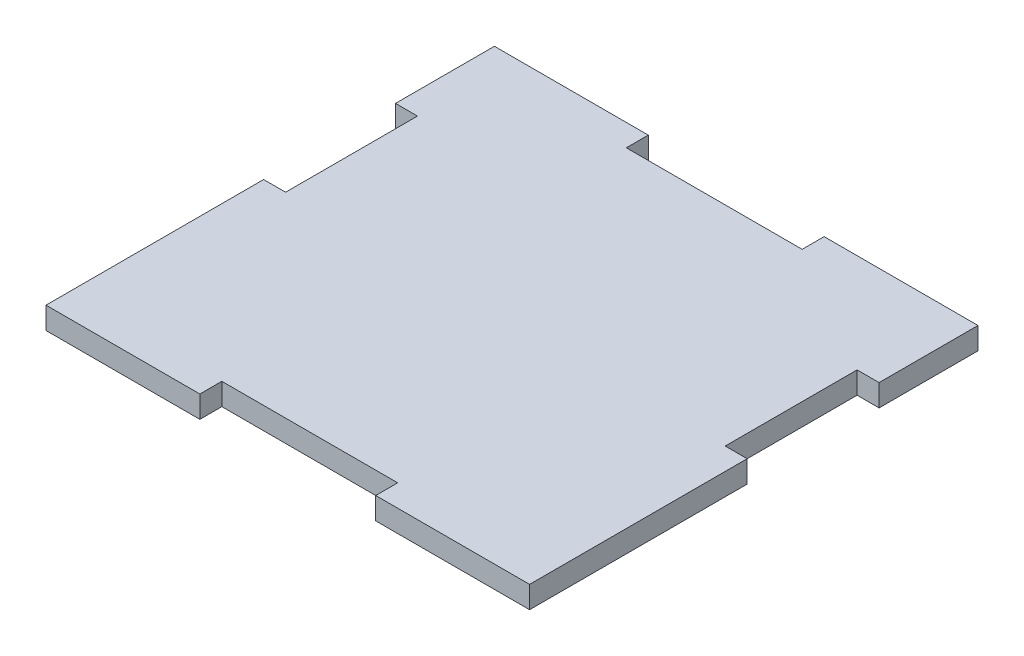
ISO-10303-21;
HEADER;
FILE_DESCRIPTION(('STEP AP214'),'2;1');
FILE_NAME('part.step','',(''),(''),'','','');
FILE_SCHEMA(('AUTOMOTIVE_DESIGN { 1 0 10303 214 1 1 1 1 }'));
ENDSEC;
DATA;
#1=APPLICATION_CONTEXT('core data for automotive mechanical design processes');
#2=APPLICATION_PROTOCOL_DEFINITION('international standard','automotive_design',2000,#1);
#3=PRODUCT_CONTEXT('',#1,'mechanical');
#4=PRODUCT('Part','Part','',(#3));
#5=PRODUCT_RELATED_PRODUCT_CATEGORY('part','',(#4));
#6=PRODUCT_DEFINITION_FORMATION('','',#4);
#7=PRODUCT_DEFINITION_CONTEXT('part definition',#1,'design');
#8=PRODUCT_DEFINITION('design','',#6,#7);
#9=PRODUCT_DEFINITION_SHAPE('','',#8);
#10=(LENGTH_UNIT() NAMED_UNIT(*) SI_UNIT(.MILLI.,.METRE.));
#11=(NAMED_UNIT(*) PLANE_ANGLE_UNIT() SI_UNIT($,.RADIAN.));
#12=(NAMED_UNIT(*) SI_UNIT($,.STERADIAN.) SOLID_ANGLE_UNIT());
#13=UNCERTAINTY_MEASURE_WITH_UNIT(LENGTH_MEASURE(1.E-05),#10,'distance_accuracy_value','');
#14=(GEOMETRIC_REPRESENTATION_CONTEXT(3) GLOBAL_UNCERTAINTY_ASSIGNED_CONTEXT((#13)) GLOBAL_UNIT_ASSIGNED_CONTEXT((#10,
#11,#12)) REPRESENTATION_CONTEXT('',''));
#15=CARTESIAN_POINT('',(0.,0.,0.));
#16=DIRECTION('',(0.,0.,1.));
#17=DIRECTION('',(1.,0.,0.));
#18=AXIS2_PLACEMENT_3D('',#15,#16,#17);
#19=CARTESIAN_POINT('',(0.,5.,0.));
#20=DIRECTION('',(1.,0.,0.));
#21=DIRECTION('',(0.,0.,-1.));
#22=AXIS2_PLACEMENT_3D('',#19,#20,#21);
#23=PLANE('',#22);
#24=DIRECTION('',(0.,0.,1.));
#25=VECTOR('',#24,1.);
#26=CARTESIAN_POINT('',(0.,0.,0.));
#27=LINE('',#26,#25);
#28=CARTESIAN_POINT('',(0.,0.,-49.5));
#29=VERTEX_POINT('',#28);
#30=CARTESIAN_POINT('',(0.,0.,0.));
#31=VERTEX_POINT('',#30);
#32=EDGE_CURVE('E214',#29,#31,#27,.T.);
#33=ORIENTED_EDGE('',*,*,#32,.T.);
#34=DIRECTION('',(0.,-1.,0.));
#35=VECTOR('',#34,1.);
#36=CARTESIAN_POINT('',(0.,5.,0.));
#37=LINE('',#36,#35);
#38=CARTESIAN_POINT('',(0.,5.,0.));
#39=VERTEX_POINT('',#38);
#40=EDGE_CURVE('E11',#39,#31,#37,.T.);
#41=ORIENTED_EDGE('',*,*,#40,.F.);
#42=DIRECTION('',(0.,0.,1.));
#43=VECTOR('',#42,1.);
#44=CARTESIAN_POINT('',(0.,5.,0.));
#45=LINE('',#44,#43);
#46=CARTESIAN_POINT('',(0.,5.,-49.5));
#47=VERTEX_POINT('',#46);
#48=EDGE_CURVE('E272',#47,#39,#45,.T.);
#49=ORIENTED_EDGE('',*,*,#48,.F.);
#50=DIRECTION('',(0.,-1.,0.));
#51=VECTOR('',#50,1.);
#52=CARTESIAN_POINT('',(0.,5.,-49.5));
#53=LINE('',#52,#51);
#54=EDGE_CURVE('E210',#47,#29,#53,.T.);
#55=ORIENTED_EDGE('',*,*,#54,.T.);
#56=EDGE_LOOP('',(#33,#41,#49,#55));
#57=FACE_BOUND('',#56,.T.);
#58=ADVANCED_FACE('F41',(#57),#23,.F.);
#59=CARTESIAN_POINT('',(0.,5.,0.));
#60=DIRECTION('',(0.,0.,-1.));
#61=DIRECTION('',(-1.,0.,0.));
#62=AXIS2_PLACEMENT_3D('',#59,#60,#61);
#63=PLANE('',#62);
#64=DIRECTION('',(1.,0.,0.));
#65=VECTOR('',#64,1.);
#66=CARTESIAN_POINT('',(0.,0.,0.));
#67=LINE('',#66,#65);
#68=CARTESIAN_POINT('',(35.,0.,0.));
#69=VERTEX_POINT('',#68);
#70=EDGE_CURVE('E218',#31,#69,#67,.T.);
#71=ORIENTED_EDGE('',*,*,#70,.T.);
#72=DIRECTION('',(0.,-1.,0.));
#73=VECTOR('',#72,1.);
#74=CARTESIAN_POINT('',(35.,5.,0.));
#75=LINE('',#74,#73);
#76=CARTESIAN_POINT('',(35.,5.,0.));
#77=VERTEX_POINT('',#76);
#78=EDGE_CURVE('E50',#77,#69,#75,.T.);
#79=ORIENTED_EDGE('',*,*,#78,.F.);
#80=DIRECTION('',(1.,0.,0.));
#81=VECTOR('',#80,1.);
#82=CARTESIAN_POINT('',(0.,5.,0.));
#83=LINE('',#82,#81);
#84=EDGE_CURVE('E137',#39,#77,#83,.T.);
#85=ORIENTED_EDGE('',*,*,#84,.F.);
#86=ORIENTED_EDGE('',*,*,#40,.T.);
#87=EDGE_LOOP('',(#71,#79,#85,#86));
#88=FACE_BOUND('',#87,.T.);
#89=ADVANCED_FACE('F422',(#88),#63,.F.);
#90=CARTESIAN_POINT('',(35.,5.,0.));
#91=DIRECTION('',(-1.,0.,0.));
#92=DIRECTION('',(0.,0.,1.));
#93=AXIS2_PLACEMENT_3D('',#90,#91,#92);
#94=PLANE('',#93);
#95=DIRECTION('',(0.,0.,-1.));
#96=VECTOR('',#95,1.);
#97=CARTESIAN_POINT('',(35.,0.,0.));
#98=LINE('',#97,#96);
#99=CARTESIAN_POINT('',(35.,0.,-5.));
#100=VERTEX_POINT('',#99);
#101=EDGE_CURVE('E221',#69,#100,#98,.T.);
#102=ORIENTED_EDGE('',*,*,#101,.T.);
#103=DIRECTION('',(0.,-1.,0.));
#104=VECTOR('',#103,1.);
#105=CARTESIAN_POINT('',(35.,5.,-5.));
#106=LINE('',#105,#104);
#107=CARTESIAN_POINT('',(35.,5.,-5.));
#108=VERTEX_POINT('',#107);
#109=EDGE_CURVE('E331',#108,#100,#106,.T.);
#110=ORIENTED_EDGE('',*,*,#109,.F.);
#111=DIRECTION('',(0.,0.,-1.));
#112=VECTOR('',#111,1.);
#113=CARTESIAN_POINT('',(35.,5.,0.));
#114=LINE('',#113,#112);
#115=EDGE_CURVE('E341',#77,#108,#114,.T.);
#116=ORIENTED_EDGE('',*,*,#115,.F.);
#117=ORIENTED_EDGE('',*,*,#78,.T.);
#118=EDGE_LOOP('',(#102,#110,#116,#117));
#119=FACE_BOUND('',#118,.T.);
#120=ADVANCED_FACE('F339',(#119),#94,.F.);
#121=CARTESIAN_POINT('',(35.,5.,-5.));
#122=DIRECTION('',(0.,0.,-1.));
#123=DIRECTION('',(-1.,0.,0.));
#124=AXIS2_PLACEMENT_3D('',#121,#122,#123);
#125=PLANE('',#124);
#126=DIRECTION('',(1.,0.,0.));
#127=VECTOR('',#126,1.);
#128=CARTESIAN_POINT('',(35.,0.,-5.));
#129=LINE('',#128,#127);
#130=CARTESIAN_POINT('',(75.,0.,-5.));
#131=VERTEX_POINT('',#130);
#132=EDGE_CURVE('E224',#100,#131,#129,.T.);
#133=ORIENTED_EDGE('',*,*,#132,.T.);
#134=DIRECTION('',(0.,-1.,0.));
#135=VECTOR('',#134,1.);
#136=CARTESIAN_POINT('',(75.,5.,-5.));
#137=LINE('',#136,#135);
#138=CARTESIAN_POINT('',(75.,5.,-5.));
#139=VERTEX_POINT('',#138);
#140=EDGE_CURVE('E327',#139,#131,#137,.T.);
#141=ORIENTED_EDGE('',*,*,#140,.F.);
#142=DIRECTION('',(1.,0.,0.));
#143=VECTOR('',#142,1.);
#144=CARTESIAN_POINT('',(35.,5.,-5.));
#145=LINE('',#144,#143);
#146=EDGE_CURVE('E360',#108,#139,#145,.T.);
#147=ORIENTED_EDGE('',*,*,#146,.F.);
#148=ORIENTED_EDGE('',*,*,#109,.T.);
#149=EDGE_LOOP('',(#133,#141,#147,#148));
#150=FACE_BOUND('',#149,.T.);
#151=ADVANCED_FACE('F350',(#150),#125,.F.);
#152=CARTESIAN_POINT('',(75.,5.,0.));
#153=DIRECTION('',(1.,0.,0.));
#154=DIRECTION('',(0.,0.,-1.));
#155=AXIS2_PLACEMENT_3D('',#152,#153,#154);
#156=PLANE('',#155);
#157=DIRECTION('',(0.,0.,1.));
#158=VECTOR('',#157,1.);
#159=CARTESIAN_POINT('',(75.,0.,0.));
#160=LINE('',#159,#158);
#161=CARTESIAN_POINT('',(75.,0.,0.));
#162=VERTEX_POINT('',#161);
#163=EDGE_CURVE('E227',#131,#162,#160,.T.);
#164=ORIENTED_EDGE('',*,*,#163,.T.);
#165=DIRECTION('',(0.,-1.,0.));
#166=VECTOR('',#165,1.);
#167=CARTESIAN_POINT('',(75.,5.,0.));
#168=LINE('',#167,#166);
#169=CARTESIAN_POINT('',(75.,5.,0.));
#170=VERTEX_POINT('',#169);
#171=EDGE_CURVE('E323',#170,#162,#168,.T.);
#172=ORIENTED_EDGE('',*,*,#171,.F.);
#173=DIRECTION('',(0.,0.,1.));
#174=VECTOR('',#173,1.);
#175=CARTESIAN_POINT('',(75.,5.,0.));
#176=LINE('',#175,#174);
#177=EDGE_CURVE('E356',#139,#170,#176,.T.);
#178=ORIENTED_EDGE('',*,*,#177,.F.);
#179=ORIENTED_EDGE('',*,*,#140,.T.);
#180=EDGE_LOOP('',(#164,#172,#178,#179));
#181=FACE_BOUND('',#180,.T.);
#182=ADVANCED_FACE('F354',(#181),#156,.F.);
#183=CARTESIAN_POINT('',(75.,5.,0.));
#184=DIRECTION('',(0.,0.,-1.));
#185=DIRECTION('',(-1.,0.,0.));
#186=AXIS2_PLACEMENT_3D('',#183,#184,#185);
#187=PLANE('',#186);
#188=DIRECTION('',(1.,0.,0.));
#189=VECTOR('',#188,1.);
#190=CARTESIAN_POINT('',(75.,0.,0.));
#191=LINE('',#190,#189);
#192=CARTESIAN_POINT('',(110.,0.,0.));
#193=VERTEX_POINT('',#192);
#194=EDGE_CURVE('E230',#162,#193,#191,.T.);
#195=ORIENTED_EDGE('',*,*,#194,.T.);
#196=DIRECTION('',(0.,-1.,0.));
#197=VECTOR('',#196,1.);
#198=CARTESIAN_POINT('',(110.,5.,0.));
#199=LINE('',#198,#197);
#200=CARTESIAN_POINT('',(110.,5.,0.));
#201=VERTEX_POINT('',#200);
#202=EDGE_CURVE('E319',#201,#193,#199,.T.);
#203=ORIENTED_EDGE('',*,*,#202,.F.);
#204=DIRECTION('',(1.,0.,0.));
#205=VECTOR('',#204,1.);
#206=CARTESIAN_POINT('',(75.,5.,0.));
#207=LINE('',#206,#205);
#208=EDGE_CURVE('E359',#170,#201,#207,.T.);
#209=ORIENTED_EDGE('',*,*,#208,.F.);
#210=ORIENTED_EDGE('',*,*,#171,.T.);
#211=EDGE_LOOP('',(#195,#203,#209,#210));
#212=FACE_BOUND('',#211,.T.);
#213=ADVANCED_FACE('F435',(#212),#187,.F.);
#214=CARTESIAN_POINT('',(110.,5.,0.));
#215=DIRECTION('',(-1.,0.,0.));
#216=DIRECTION('',(0.,0.,1.));
#217=AXIS2_PLACEMENT_3D('',#214,#215,#216);
#218=PLANE('',#217);
#219=DIRECTION('',(0.,0.,-1.));
#220=VECTOR('',#219,1.);
#221=CARTESIAN_POINT('',(110.,0.,0.));
#222=LINE('',#221,#220);
#223=CARTESIAN_POINT('',(110.,0.,-49.5));
#224=VERTEX_POINT('',#223);
#225=EDGE_CURVE('E233',#193,#224,#222,.T.);
#226=ORIENTED_EDGE('',*,*,#225,.T.);
#227=DIRECTION('',(0.,-1.,0.));
#228=VECTOR('',#227,1.);
#229=CARTESIAN_POINT('',(110.,5.,-49.5));
#230=LINE('',#229,#228);
#231=CARTESIAN_POINT('',(110.,5.,-49.5));
#232=VERTEX_POINT('',#231);
#233=EDGE_CURVE('E315',#232,#224,#230,.T.);
#234=ORIENTED_EDGE('',*,*,#233,.F.);
#235=DIRECTION('',(0.,0.,-1.));
#236=VECTOR('',#235,1.);
#237=CARTESIAN_POINT('',(110.,5.,0.));
#238=LINE('',#237,#236);
#239=EDGE_CURVE('E364',#201,#232,#238,.T.);
#240=ORIENTED_EDGE('',*,*,#239,.F.);
#241=ORIENTED_EDGE('',*,*,#202,.T.);
#242=EDGE_LOOP('',(#226,#234,#240,#241));
#243=FACE_BOUND('',#242,.T.);
#244=ADVANCED_FACE('F438',(#243),#218,.F.);
#245=CARTESIAN_POINT('',(110.,5.,-49.5));
#246=DIRECTION('',(0.,0.,1.));
#247=DIRECTION('',(1.,0.,0.));
#248=AXIS2_PLACEMENT_3D('',#245,#246,#247);
#249=PLANE('',#248);
#250=DIRECTION('',(-1.,0.,0.));
#251=VECTOR('',#250,1.);
#252=CARTESIAN_POINT('',(110.,0.,-49.5));
#253=LINE('',#252,#251);
#254=CARTESIAN_POINT('',(105.,0.,-49.5));
#255=VERTEX_POINT('',#254);
#256=EDGE_CURVE('E236',#224,#255,#253,.T.);
#257=ORIENTED_EDGE('',*,*,#256,.T.);
#258=DIRECTION('',(0.,-1.,0.));
#259=VECTOR('',#258,1.);
#260=CARTESIAN_POINT('',(105.,5.,-49.5));
#261=LINE('',#260,#259);
#262=CARTESIAN_POINT('',(105.,5.,-49.5));
#263=VERTEX_POINT('',#262);
#264=EDGE_CURVE('E311',#263,#255,#261,.T.);
#265=ORIENTED_EDGE('',*,*,#264,.F.);
#266=DIRECTION('',(-1.,0.,0.));
#267=VECTOR('',#266,1.);
#268=CARTESIAN_POINT('',(110.,5.,-49.5));
#269=LINE('',#268,#267);
#270=EDGE_CURVE('E371',#232,#263,#269,.T.);
#271=ORIENTED_EDGE('',*,*,#270,.F.);
#272=ORIENTED_EDGE('',*,*,#233,.T.);
#273=EDGE_LOOP('',(#257,#265,#271,#272));
#274=FACE_BOUND('',#273,.T.);
#275=ADVANCED_FACE('F442',(#274),#249,.F.);
#276=CARTESIAN_POINT('',(105.,5.,-79.5));
#277=DIRECTION('',(-1.,0.,0.));
#278=DIRECTION('',(0.,0.,1.));
#279=AXIS2_PLACEMENT_3D('',#276,#277,#278);
#280=PLANE('',#279);
#281=DIRECTION('',(0.,0.,-1.));
#282=VECTOR('',#281,1.);
#283=CARTESIAN_POINT('',(105.,0.,-79.5));
#284=LINE('',#283,#282);
#285=CARTESIAN_POINT('',(105.,0.,-79.5));
#286=VERTEX_POINT('',#285);
#287=EDGE_CURVE('E239',#255,#286,#284,.T.);
#288=ORIENTED_EDGE('',*,*,#287,.T.);
#289=DIRECTION('',(0.,-1.,0.));
#290=VECTOR('',#289,1.);
#291=CARTESIAN_POINT('',(105.,5.,-79.5));
#292=LINE('',#291,#290);
#293=CARTESIAN_POINT('',(105.,5.,-79.5));
#294=VERTEX_POINT('',#293);
#295=EDGE_CURVE('E307',#294,#286,#292,.T.);
#296=ORIENTED_EDGE('',*,*,#295,.F.);
#297=DIRECTION('',(0.,0.,-1.));
#298=VECTOR('',#297,1.);
#299=CARTESIAN_POINT('',(105.,5.,-79.5));
#300=LINE('',#299,#298);
#301=EDGE_CURVE('E374',#263,#294,#300,.T.);
#302=ORIENTED_EDGE('',*,*,#301,.F.);
#303=ORIENTED_EDGE('',*,*,#264,.T.);
#304=EDGE_LOOP('',(#288,#296,#302,#303));
#305=FACE_BOUND('',#304,.T.);
#306=ADVANCED_FACE('F446',(#305),#280,.F.);
#307=CARTESIAN_POINT('',(110.,5.,-79.5));
#308=DIRECTION('',(0.,0.,-1.));
#309=DIRECTION('',(-1.,0.,0.));
#310=AXIS2_PLACEMENT_3D('',#307,#308,#309);
#311=PLANE('',#310);
#312=DIRECTION('',(1.,0.,0.));
#313=VECTOR('',#312,1.);
#314=CARTESIAN_POINT('',(110.,0.,-79.5));
#315=LINE('',#314,#313);
#316=CARTESIAN_POINT('',(110.,0.,-79.5));
#317=VERTEX_POINT('',#316);
#318=EDGE_CURVE('E242',#286,#317,#315,.T.);
#319=ORIENTED_EDGE('',*,*,#318,.T.);
#320=DIRECTION('',(0.,-1.,0.));
#321=VECTOR('',#320,1.);
#322=CARTESIAN_POINT('',(110.,5.,-79.5));
#323=LINE('',#322,#321);
#324=CARTESIAN_POINT('',(110.,5.,-79.5));
#325=VERTEX_POINT('',#324);
#326=EDGE_CURVE('E303',#325,#317,#323,.T.);
#327=ORIENTED_EDGE('',*,*,#326,.F.);
#328=DIRECTION('',(1.,0.,0.));
#329=VECTOR('',#328,1.);
#330=CARTESIAN_POINT('',(110.,5.,-79.5));
#331=LINE('',#330,#329);
#332=EDGE_CURVE('E377',#294,#325,#331,.T.);
#333=ORIENTED_EDGE('',*,*,#332,.F.);
#334=ORIENTED_EDGE('',*,*,#295,.T.);
#335=EDGE_LOOP('',(#319,#327,#333,#334));
#336=FACE_BOUND('',#335,.T.);
#337=ADVANCED_FACE('F450',(#336),#311,.F.);
#338=CARTESIAN_POINT('',(110.,5.,-79.5));
#339=DIRECTION('',(-1.,0.,0.));
#340=DIRECTION('',(0.,0.,1.));
#341=AXIS2_PLACEMENT_3D('',#338,#339,#340);
#342=PLANE('',#341);
#343=DIRECTION('',(0.,0.,-1.));
#344=VECTOR('',#343,1.);
#345=CARTESIAN_POINT('',(110.,0.,-79.5));
#346=LINE('',#345,#344);
#347=CARTESIAN_POINT('',(110.,0.,-102.));
#348=VERTEX_POINT('',#347);
#349=EDGE_CURVE('E245',#317,#348,#346,.T.);
#350=ORIENTED_EDGE('',*,*,#349,.T.);
#351=DIRECTION('',(0.,-1.,0.));
#352=VECTOR('',#351,1.);
#353=CARTESIAN_POINT('',(110.,5.,-102.));
#354=LINE('',#353,#352);
#355=CARTESIAN_POINT('',(110.,5.,-102.));
#356=VERTEX_POINT('',#355);
#357=EDGE_CURVE('E299',#356,#348,#354,.T.);
#358=ORIENTED_EDGE('',*,*,#357,.F.);
#359=DIRECTION('',(0.,0.,-1.));
#360=VECTOR('',#359,1.);
#361=CARTESIAN_POINT('',(110.,5.,-79.5));
#362=LINE('',#361,#360);
#363=EDGE_CURVE('E380',#325,#356,#362,.T.);
#364=ORIENTED_EDGE('',*,*,#363,.F.);
#365=ORIENTED_EDGE('',*,*,#326,.T.);
#366=EDGE_LOOP('',(#350,#358,#364,#365));
#367=FACE_BOUND('',#366,.T.);
#368=ADVANCED_FACE('F454',(#367),#342,.F.);
#369=CARTESIAN_POINT('',(75.,5.,-102.));
#370=DIRECTION('',(0.,0.,1.));
#371=DIRECTION('',(1.,0.,0.));
#372=AXIS2_PLACEMENT_3D('',#369,#370,#371);
#373=PLANE('',#372);
#374=DIRECTION('',(-1.,0.,0.));
#375=VECTOR('',#374,1.);
#376=CARTESIAN_POINT('',(75.,0.,-102.));
#377=LINE('',#376,#375);
#378=CARTESIAN_POINT('',(75.,0.,-102.));
#379=VERTEX_POINT('',#378);
#380=EDGE_CURVE('E248',#348,#379,#377,.T.);
#381=ORIENTED_EDGE('',*,*,#380,.T.);
#382=DIRECTION('',(0.,-1.,0.));
#383=VECTOR('',#382,1.);
#384=CARTESIAN_POINT('',(75.,5.,-102.));
#385=LINE('',#384,#383);
#386=CARTESIAN_POINT('',(75.,5.,-102.));
#387=VERTEX_POINT('',#386);
#388=EDGE_CURVE('E295',#387,#379,#385,.T.);
#389=ORIENTED_EDGE('',*,*,#388,.F.);
#390=DIRECTION('',(-1.,0.,0.));
#391=VECTOR('',#390,1.);
#392=CARTESIAN_POINT('',(75.,5.,-102.));
#393=LINE('',#392,#391);
#394=EDGE_CURVE('E383',#356,#387,#393,.T.);
#395=ORIENTED_EDGE('',*,*,#394,.F.);
#396=ORIENTED_EDGE('',*,*,#357,.T.);
#397=EDGE_LOOP('',(#381,#389,#395,#396));
#398=FACE_BOUND('',#397,.T.);
#399=ADVANCED_FACE('F458',(#398),#373,.F.);
#400=CARTESIAN_POINT('',(75.,5.,-102.));
#401=DIRECTION('',(1.,0.,0.));
#402=DIRECTION('',(0.,0.,-1.));
#403=AXIS2_PLACEMENT_3D('',#400,#401,#402);
#404=PLANE('',#403);
#405=DIRECTION('',(0.,0.,1.));
#406=VECTOR('',#405,1.);
#407=CARTESIAN_POINT('',(75.,0.,-102.));
#408=LINE('',#407,#406);
#409=CARTESIAN_POINT('',(75.,0.,-97.));
#410=VERTEX_POINT('',#409);
#411=EDGE_CURVE('E251',#379,#410,#408,.T.);
#412=ORIENTED_EDGE('',*,*,#411,.T.);
#413=DIRECTION('',(0.,-1.,0.));
#414=VECTOR('',#413,1.);
#415=CARTESIAN_POINT('',(75.,5.,-97.));
#416=LINE('',#415,#414);
#417=CARTESIAN_POINT('',(75.,5.,-97.));
#418=VERTEX_POINT('',#417);
#419=EDGE_CURVE('E291',#418,#410,#416,.T.);
#420=ORIENTED_EDGE('',*,*,#419,.F.);
#421=DIRECTION('',(0.,0.,1.));
#422=VECTOR('',#421,1.);
#423=CARTESIAN_POINT('',(75.,5.,-102.));
#424=LINE('',#423,#422);
#425=EDGE_CURVE('E386',#387,#418,#424,.T.);
#426=ORIENTED_EDGE('',*,*,#425,.F.);
#427=ORIENTED_EDGE('',*,*,#388,.T.);
#428=EDGE_LOOP('',(#412,#420,#426,#427));
#429=FACE_BOUND('',#428,.T.);
#430=ADVANCED_FACE('F462',(#429),#404,.F.);
#431=CARTESIAN_POINT('',(35.,5.,-97.));
#432=DIRECTION('',(0.,0.,1.));
#433=DIRECTION('',(1.,0.,0.));
#434=AXIS2_PLACEMENT_3D('',#431,#432,#433);
#435=PLANE('',#434);
#436=DIRECTION('',(-1.,0.,0.));
#437=VECTOR('',#436,1.);
#438=CARTESIAN_POINT('',(35.,0.,-97.));
#439=LINE('',#438,#437);
#440=CARTESIAN_POINT('',(35.,0.,-97.));
#441=VERTEX_POINT('',#440);
#442=EDGE_CURVE('E254',#410,#441,#439,.T.);
#443=ORIENTED_EDGE('',*,*,#442,.T.);
#444=DIRECTION('',(0.,-1.,0.));
#445=VECTOR('',#444,1.);
#446=CARTESIAN_POINT('',(35.,5.,-97.));
#447=LINE('',#446,#445);
#448=CARTESIAN_POINT('',(35.,5.,-97.));
#449=VERTEX_POINT('',#448);
#450=EDGE_CURVE('E287',#449,#441,#447,.T.);
#451=ORIENTED_EDGE('',*,*,#450,.F.);
#452=DIRECTION('',(-1.,0.,0.));
#453=VECTOR('',#452,1.);
#454=CARTESIAN_POINT('',(35.,5.,-97.));
#455=LINE('',#454,#453);
#456=EDGE_CURVE('E389',#418,#449,#455,.T.);
#457=ORIENTED_EDGE('',*,*,#456,.F.);
#458=ORIENTED_EDGE('',*,*,#419,.T.);
#459=EDGE_LOOP('',(#443,#451,#457,#458));
#460=FACE_BOUND('',#459,.T.);
#461=ADVANCED_FACE('F466',(#460),#435,.F.);
#462=CARTESIAN_POINT('',(35.,5.,-102.));
#463=DIRECTION('',(-1.,0.,0.));
#464=DIRECTION('',(0.,0.,1.));
#465=AXIS2_PLACEMENT_3D('',#462,#463,#464);
#466=PLANE('',#465);
#467=DIRECTION('',(0.,0.,-1.));
#468=VECTOR('',#467,1.);
#469=CARTESIAN_POINT('',(35.,0.,-102.));
#470=LINE('',#469,#468);
#471=CARTESIAN_POINT('',(35.,0.,-102.));
#472=VERTEX_POINT('',#471);
#473=EDGE_CURVE('E257',#441,#472,#470,.T.);
#474=ORIENTED_EDGE('',*,*,#473,.T.);
#475=DIRECTION('',(0.,-1.,0.));
#476=VECTOR('',#475,1.);
#477=CARTESIAN_POINT('',(35.,5.,-102.));
#478=LINE('',#477,#476);
#479=CARTESIAN_POINT('',(35.,5.,-102.));
#480=VERTEX_POINT('',#479);
#481=EDGE_CURVE('E283',#480,#472,#478,.T.);
#482=ORIENTED_EDGE('',*,*,#481,.F.);
#483=DIRECTION('',(0.,0.,-1.));
#484=VECTOR('',#483,1.);
#485=CARTESIAN_POINT('',(35.,5.,-102.));
#486=LINE('',#485,#484);
#487=EDGE_CURVE('E392',#449,#480,#486,.T.);
#488=ORIENTED_EDGE('',*,*,#487,.F.);
#489=ORIENTED_EDGE('',*,*,#450,.T.);
#490=EDGE_LOOP('',(#474,#482,#488,#489));
#491=FACE_BOUND('',#490,.T.);
#492=ADVANCED_FACE('F470',(#491),#466,.F.);
#493=CARTESIAN_POINT('',(0.,5.,-102.));
#494=DIRECTION('',(0.,0.,1.));
#495=DIRECTION('',(1.,0.,0.));
#496=AXIS2_PLACEMENT_3D('',#493,#494,#495);
#497=PLANE('',#496);
#498=DIRECTION('',(-1.,0.,0.));
#499=VECTOR('',#498,1.);
#500=CARTESIAN_POINT('',(0.,0.,-102.));
#501=LINE('',#500,#499);
#502=CARTESIAN_POINT('',(0.,0.,-102.));
#503=VERTEX_POINT('',#502);
#504=EDGE_CURVE('E260',#472,#503,#501,.T.);
#505=ORIENTED_EDGE('',*,*,#504,.T.);
#506=DIRECTION('',(0.,-1.,0.));
#507=VECTOR('',#506,1.);
#508=CARTESIAN_POINT('',(0.,5.,-102.));
#509=LINE('',#508,#507);
#510=CARTESIAN_POINT('',(0.,5.,-102.));
#511=VERTEX_POINT('',#510);
#512=EDGE_CURVE('E279',#511,#503,#509,.T.);
#513=ORIENTED_EDGE('',*,*,#512,.F.);
#514=DIRECTION('',(-1.,0.,0.));
#515=VECTOR('',#514,1.);
#516=CARTESIAN_POINT('',(0.,5.,-102.));
#517=LINE('',#516,#515);
#518=EDGE_CURVE('E395',#480,#511,#517,.T.);
#519=ORIENTED_EDGE('',*,*,#518,.F.);
#520=ORIENTED_EDGE('',*,*,#481,.T.);
#521=EDGE_LOOP('',(#505,#513,#519,#520));
#522=FACE_BOUND('',#521,.T.);
#523=ADVANCED_FACE('F403',(#522),#497,.F.);
#524=CARTESIAN_POINT('',(0.,5.,-79.5));
#525=DIRECTION('',(1.,0.,0.));
#526=DIRECTION('',(0.,0.,-1.));
#527=AXIS2_PLACEMENT_3D('',#524,#525,#526);
#528=PLANE('',#527);
#529=DIRECTION('',(0.,0.,1.));
#530=VECTOR('',#529,1.);
#531=CARTESIAN_POINT('',(0.,0.,-79.5));
#532=LINE('',#531,#530);
#533=CARTESIAN_POINT('',(0.,0.,-79.5));
#534=VERTEX_POINT('',#533);
#535=EDGE_CURVE('E263',#503,#534,#532,.T.);
#536=ORIENTED_EDGE('',*,*,#535,.T.);
#537=DIRECTION('',(0.,-1.,0.));
#538=VECTOR('',#537,1.);
#539=CARTESIAN_POINT('',(0.,5.,-79.5));
#540=LINE('',#539,#538);
#541=CARTESIAN_POINT('',(0.,5.,-79.5));
#542=VERTEX_POINT('',#541);
#543=EDGE_CURVE('E203',#542,#534,#540,.T.);
#544=ORIENTED_EDGE('',*,*,#543,.F.);
#545=DIRECTION('',(0.,0.,1.));
#546=VECTOR('',#545,1.);
#547=CARTESIAN_POINT('',(0.,5.,-79.5));
#548=LINE('',#547,#546);
#549=EDGE_CURVE('E192',#511,#542,#548,.T.);
#550=ORIENTED_EDGE('',*,*,#549,.F.);
#551=ORIENTED_EDGE('',*,*,#512,.T.);
#552=EDGE_LOOP('',(#536,#544,#550,#551));
#553=FACE_BOUND('',#552,.T.);
#554=ADVANCED_FACE('F407',(#553),#528,.F.);
#555=CARTESIAN_POINT('',(0.,5.,-79.5));
#556=DIRECTION('',(0.,0.,-1.));
#557=DIRECTION('',(-1.,0.,0.));
#558=AXIS2_PLACEMENT_3D('',#555,#556,#557);
#559=PLANE('',#558);
#560=DIRECTION('',(1.,0.,0.));
#561=VECTOR('',#560,1.);
#562=CARTESIAN_POINT('',(0.,0.,-79.5));
#563=LINE('',#562,#561);
#564=CARTESIAN_POINT('',(5.,0.,-79.5));
#565=VERTEX_POINT('',#564);
#566=EDGE_CURVE('E201',#534,#565,#563,.T.);
#567=ORIENTED_EDGE('',*,*,#566,.T.);
#568=DIRECTION('',(0.,-1.,0.));
#569=VECTOR('',#568,1.);
#570=CARTESIAN_POINT('',(5.,5.,-79.5));
#571=LINE('',#570,#569);
#572=CARTESIAN_POINT('',(5.,5.,-79.5));
#573=VERTEX_POINT('',#572);
#574=EDGE_CURVE('E198',#573,#565,#571,.T.);
#575=ORIENTED_EDGE('',*,*,#574,.F.);
#576=DIRECTION('',(1.,0.,0.));
#577=VECTOR('',#576,1.);
#578=CARTESIAN_POINT('',(0.,5.,-79.5));
#579=LINE('',#578,#577);
#580=EDGE_CURVE('E186',#542,#573,#579,.T.);
#581=ORIENTED_EDGE('',*,*,#580,.F.);
#582=ORIENTED_EDGE('',*,*,#543,.T.);
#583=EDGE_LOOP('',(#567,#575,#581,#582));
#584=FACE_BOUND('',#583,.T.);
#585=ADVANCED_FACE('F199',(#584),#559,.F.);
#586=CARTESIAN_POINT('',(5.,5.,-79.5));
#587=DIRECTION('',(1.,0.,0.));
#588=DIRECTION('',(0.,0.,-1.));
#589=AXIS2_PLACEMENT_3D('',#586,#587,#588);
#590=PLANE('',#589);
#591=DIRECTION('',(0.,0.,1.));
#592=VECTOR('',#591,1.);
#593=CARTESIAN_POINT('',(5.,0.,-79.5));
#594=LINE('',#593,#592);
#595=CARTESIAN_POINT('',(5.,0.,-49.5));
#596=VERTEX_POINT('',#595);
#597=EDGE_CURVE('E123',#565,#596,#594,.T.);
#598=ORIENTED_EDGE('',*,*,#597,.T.);
#599=DIRECTION('',(0.,-1.,0.));
#600=VECTOR('',#599,1.);
#601=CARTESIAN_POINT('',(5.,5.,-49.5));
#602=LINE('',#601,#600);
#603=CARTESIAN_POINT('',(5.,5.,-49.5));
#604=VERTEX_POINT('',#603);
#605=EDGE_CURVE('E204',#604,#596,#602,.T.);
#606=ORIENTED_EDGE('',*,*,#605,.F.);
#607=DIRECTION('',(0.,0.,1.));
#608=VECTOR('',#607,1.);
#609=CARTESIAN_POINT('',(5.,5.,-79.5));
#610=LINE('',#609,#608);
#611=EDGE_CURVE('E190',#573,#604,#610,.T.);
#612=ORIENTED_EDGE('',*,*,#611,.F.);
#613=ORIENTED_EDGE('',*,*,#574,.T.);
#614=EDGE_LOOP('',(#598,#606,#612,#613));
#615=FACE_BOUND('',#614,.T.);
#616=ADVANCED_FACE('F206',(#615),#590,.F.);
#617=CARTESIAN_POINT('',(0.,5.,-49.5));
#618=DIRECTION('',(0.,0.,1.));
#619=DIRECTION('',(1.,0.,0.));
#620=AXIS2_PLACEMENT_3D('',#617,#618,#619);
#621=PLANE('',#620);
#622=DIRECTION('',(-1.,0.,0.));
#623=VECTOR('',#622,1.);
#624=CARTESIAN_POINT('',(0.,0.,-49.5));
#625=LINE('',#624,#623);
#626=EDGE_CURVE('E129',#596,#29,#625,.T.);
#627=ORIENTED_EDGE('',*,*,#626,.T.);
#628=ORIENTED_EDGE('',*,*,#54,.F.);
#629=DIRECTION('',(-1.,0.,0.));
#630=VECTOR('',#629,1.);
#631=CARTESIAN_POINT('',(0.,5.,-49.5));
#632=LINE('',#631,#630);
#633=EDGE_CURVE('E58',#604,#47,#632,.T.);
#634=ORIENTED_EDGE('',*,*,#633,.F.);
#635=ORIENTED_EDGE('',*,*,#605,.T.);
#636=EDGE_LOOP('',(#627,#628,#634,#635));
#637=FACE_BOUND('',#636,.T.);
#638=ADVANCED_FACE('F411',(#637),#621,.F.);
#639=CARTESIAN_POINT('',(0.,5.,0.));
#640=DIRECTION('',(0.,-1.,0.));
#641=DIRECTION('',(0.,0.,-1.));
#642=AXIS2_PLACEMENT_3D('',#639,#640,#641);
#643=PLANE('',#642);
#644=ORIENTED_EDGE('',*,*,#48,.T.);
#645=ORIENTED_EDGE('',*,*,#84,.T.);
#646=ORIENTED_EDGE('',*,*,#115,.T.);
#647=ORIENTED_EDGE('',*,*,#146,.T.);
#648=ORIENTED_EDGE('',*,*,#177,.T.);
#649=ORIENTED_EDGE('',*,*,#208,.T.);
#650=ORIENTED_EDGE('',*,*,#239,.T.);
#651=ORIENTED_EDGE('',*,*,#270,.T.);
#652=ORIENTED_EDGE('',*,*,#301,.T.);
#653=ORIENTED_EDGE('',*,*,#332,.T.);
#654=ORIENTED_EDGE('',*,*,#363,.T.);
#655=ORIENTED_EDGE('',*,*,#394,.T.);
#656=ORIENTED_EDGE('',*,*,#425,.T.);
#657=ORIENTED_EDGE('',*,*,#456,.T.);
#658=ORIENTED_EDGE('',*,*,#487,.T.);
#659=ORIENTED_EDGE('',*,*,#518,.T.);
#660=ORIENTED_EDGE('',*,*,#549,.T.);
#661=ORIENTED_EDGE('',*,*,#580,.T.);
#662=ORIENTED_EDGE('',*,*,#611,.T.);
#663=ORIENTED_EDGE('',*,*,#633,.T.);
#664=EDGE_LOOP('',(#644,#645,#646,#647,#648,#649,#650,#651,#652,#653,#654,#655,#656,#657,#658,
#659,#660,#661,#662,#663));
#665=FACE_BOUND('',#664,.T.);
#666=ADVANCED_FACE('F188',(#665),#643,.F.);
#667=CARTESIAN_POINT('',(0.,0.,0.));
#668=DIRECTION('',(0.,-1.,0.));
#669=DIRECTION('',(0.,0.,-1.));
#670=AXIS2_PLACEMENT_3D('',#667,#668,#669);
#671=PLANE('',#670);
#672=ORIENTED_EDGE('',*,*,#32,.F.);
#673=ORIENTED_EDGE('',*,*,#626,.F.);
#674=ORIENTED_EDGE('',*,*,#597,.F.);
#675=ORIENTED_EDGE('',*,*,#566,.F.);
#676=ORIENTED_EDGE('',*,*,#535,.F.);
#677=ORIENTED_EDGE('',*,*,#504,.F.);
#678=ORIENTED_EDGE('',*,*,#473,.F.);
#679=ORIENTED_EDGE('',*,*,#442,.F.);
#680=ORIENTED_EDGE('',*,*,#411,.F.);
#681=ORIENTED_EDGE('',*,*,#380,.F.);
#682=ORIENTED_EDGE('',*,*,#349,.F.);
#683=ORIENTED_EDGE('',*,*,#318,.F.);
#684=ORIENTED_EDGE('',*,*,#287,.F.);
#685=ORIENTED_EDGE('',*,*,#256,.F.);
#686=ORIENTED_EDGE('',*,*,#225,.F.);
#687=ORIENTED_EDGE('',*,*,#194,.F.);
#688=ORIENTED_EDGE('',*,*,#163,.F.);
#689=ORIENTED_EDGE('',*,*,#132,.F.);
#690=ORIENTED_EDGE('',*,*,#101,.F.);
#691=ORIENTED_EDGE('',*,*,#70,.F.);
#692=EDGE_LOOP('',(#672,#673,#674,#675,#676,#677,#678,#679,#680,#681,#682,#683,#684,#685,#686,
#687,#688,#689,#690,#691));
#693=FACE_BOUND('',#692,.T.);
#694=ADVANCED_FACE('F345',(#693),#671,.T.);
#695=CLOSED_SHELL('',(#58,#89,#120,#151,#182,#213,#244,#275,#306,#337,#368,#399,#430,#461,#492,
#523,#554,#585,#616,#638,#666,#694));
#696=MANIFOLD_SOLID_BREP('B2',#695);
#697=ADVANCED_BREP_SHAPE_REPRESENTATION('',(#18,#696),#14);
#698=SHAPE_DEFINITION_REPRESENTATION(#9,#697);
ENDSEC;
END-ISO-10303-21;
